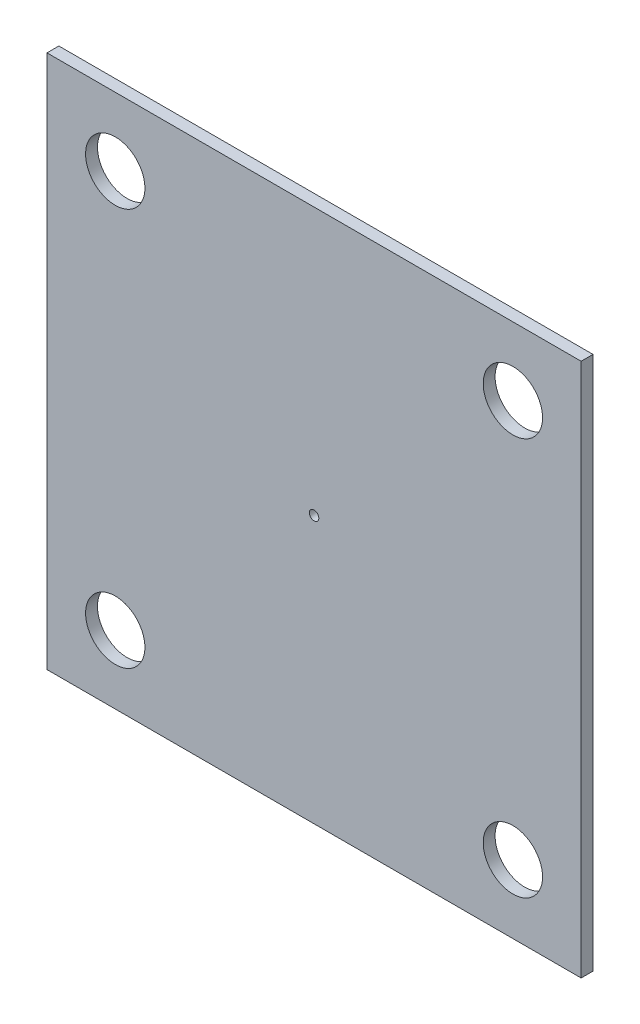
ISO-10303-21;
HEADER;
FILE_DESCRIPTION(('STEP AP214'),'2;1');
FILE_NAME('part.step','',(''),(''),'','','');
FILE_SCHEMA(('AUTOMOTIVE_DESIGN { 1 0 10303 214 1 1 1 1 }'));
ENDSEC;
DATA;
#1=APPLICATION_CONTEXT('core data for automotive mechanical design processes');
#2=APPLICATION_PROTOCOL_DEFINITION('international standard','automotive_design',2000,#1);
#3=PRODUCT_CONTEXT('',#1,'mechanical');
#4=PRODUCT('Part','Part','',(#3));
#5=PRODUCT_RELATED_PRODUCT_CATEGORY('part','',(#4));
#6=PRODUCT_DEFINITION_FORMATION('','',#4);
#7=PRODUCT_DEFINITION_CONTEXT('part definition',#1,'design');
#8=PRODUCT_DEFINITION('design','',#6,#7);
#9=PRODUCT_DEFINITION_SHAPE('','',#8);
#10=(LENGTH_UNIT() NAMED_UNIT(*) SI_UNIT(.MILLI.,.METRE.));
#11=(NAMED_UNIT(*) PLANE_ANGLE_UNIT() SI_UNIT($,.RADIAN.));
#12=(NAMED_UNIT(*) SI_UNIT($,.STERADIAN.) SOLID_ANGLE_UNIT());
#13=UNCERTAINTY_MEASURE_WITH_UNIT(LENGTH_MEASURE(1.E-05),#10,'distance_accuracy_value','');
#14=(GEOMETRIC_REPRESENTATION_CONTEXT(3) GLOBAL_UNCERTAINTY_ASSIGNED_CONTEXT((#13)) GLOBAL_UNIT_ASSIGNED_CONTEXT((#10,
#11,#12)) REPRESENTATION_CONTEXT('',''));
#15=CARTESIAN_POINT('',(0.,0.,0.));
#16=DIRECTION('',(0.,0.,1.));
#17=DIRECTION('',(1.,0.,0.));
#18=AXIS2_PLACEMENT_3D('',#15,#16,#17);
#19=CARTESIAN_POINT('',(0.,0.,5.));
#20=DIRECTION('',(0.,0.,1.));
#21=DIRECTION('',(1.,0.,0.));
#22=AXIS2_PLACEMENT_3D('',#19,#20,#21);
#23=PLANE('',#22);
#24=CARTESIAN_POINT('',(167.5,167.5,5.));
#25=DIRECTION('',(0.,0.,1.));
#26=DIRECTION('',(1.,0.,0.));
#27=AXIS2_PLACEMENT_3D('',#24,#25,#26);
#28=CIRCLE('',#27,25.);
#29=CARTESIAN_POINT('',(192.5,167.5,5.));
#30=VERTEX_POINT('',#29);
#31=EDGE_CURVE('E127',#30,#30,#28,.T.);
#32=ORIENTED_EDGE('',*,*,#31,.F.);
#33=EDGE_LOOP('',(#32));
#34=FACE_BOUND('',#33,.T.);
#35=CARTESIAN_POINT('',(-167.5,-167.5,5.));
#36=DIRECTION('',(0.,0.,1.));
#37=DIRECTION('',(1.,0.,0.));
#38=AXIS2_PLACEMENT_3D('',#35,#36,#37);
#39=CIRCLE('',#38,25.);
#40=CARTESIAN_POINT('',(-142.5,-167.5,5.));
#41=VERTEX_POINT('',#40);
#42=EDGE_CURVE('E115',#41,#41,#39,.T.);
#43=ORIENTED_EDGE('',*,*,#42,.F.);
#44=EDGE_LOOP('',(#43));
#45=FACE_BOUND('',#44,.T.);
#46=DIRECTION('',(0.,1.,0.));
#47=VECTOR('',#46,1.);
#48=CARTESIAN_POINT('',(225.,225.,5.));
#49=LINE('',#48,#47);
#50=CARTESIAN_POINT('',(225.,-225.,5.));
#51=VERTEX_POINT('',#50);
#52=CARTESIAN_POINT('',(225.,225.,5.));
#53=VERTEX_POINT('',#52);
#54=EDGE_CURVE('E85',#51,#53,#49,.T.);
#55=ORIENTED_EDGE('',*,*,#54,.T.);
#56=DIRECTION('',(-1.,0.,0.));
#57=VECTOR('',#56,1.);
#58=CARTESIAN_POINT('',(-225.,225.,5.));
#59=LINE('',#58,#57);
#60=CARTESIAN_POINT('',(-225.,225.,5.));
#61=VERTEX_POINT('',#60);
#62=EDGE_CURVE('E80',#53,#61,#59,.T.);
#63=ORIENTED_EDGE('',*,*,#62,.T.);
#64=DIRECTION('',(0.,-1.,0.));
#65=VECTOR('',#64,1.);
#66=CARTESIAN_POINT('',(-225.,225.,5.));
#67=LINE('',#66,#65);
#68=CARTESIAN_POINT('',(-225.,-225.,5.));
#69=VERTEX_POINT('',#68);
#70=EDGE_CURVE('E83',#61,#69,#67,.T.);
#71=ORIENTED_EDGE('',*,*,#70,.T.);
#72=DIRECTION('',(1.,0.,0.));
#73=VECTOR('',#72,1.);
#74=CARTESIAN_POINT('',(-225.,-225.,5.));
#75=LINE('',#74,#73);
#76=EDGE_CURVE('E50',#69,#51,#75,.T.);
#77=ORIENTED_EDGE('',*,*,#76,.T.);
#78=EDGE_LOOP('',(#55,#63,#71,#77));
#79=FACE_BOUND('',#78,.T.);
#80=CARTESIAN_POINT('',(0.,0.,5.));
#81=DIRECTION('',(0.,0.,1.));
#82=DIRECTION('',(1.,0.,0.));
#83=AXIS2_PLACEMENT_3D('',#80,#81,#82);
#84=CIRCLE('',#83,4.);
#85=CARTESIAN_POINT('',(4.,0.,5.));
#86=VERTEX_POINT('',#85);
#87=EDGE_CURVE('E100',#86,#86,#84,.T.);
#88=ORIENTED_EDGE('',*,*,#87,.F.);
#89=EDGE_LOOP('',(#88));
#90=FACE_BOUND('',#89,.T.);
#91=CARTESIAN_POINT('',(167.5,-167.5,5.));
#92=DIRECTION('',(0.,0.,1.));
#93=DIRECTION('',(1.,0.,0.));
#94=AXIS2_PLACEMENT_3D('',#91,#92,#93);
#95=CIRCLE('',#94,25.);
#96=CARTESIAN_POINT('',(192.5,-167.5,5.));
#97=VERTEX_POINT('',#96);
#98=EDGE_CURVE('E121',#97,#97,#95,.T.);
#99=ORIENTED_EDGE('',*,*,#98,.F.);
#100=EDGE_LOOP('',(#99));
#101=FACE_BOUND('',#100,.T.);
#102=CARTESIAN_POINT('',(-167.5,167.5,5.));
#103=DIRECTION('',(0.,0.,1.));
#104=DIRECTION('',(1.,0.,0.));
#105=AXIS2_PLACEMENT_3D('',#102,#103,#104);
#106=CIRCLE('',#105,25.);
#107=CARTESIAN_POINT('',(-142.5,167.5,5.));
#108=VERTEX_POINT('',#107);
#109=EDGE_CURVE('E133',#108,#108,#106,.T.);
#110=ORIENTED_EDGE('',*,*,#109,.F.);
#111=EDGE_LOOP('',(#110));
#112=FACE_BOUND('',#111,.T.);
#113=ADVANCED_FACE('F33',(#34,#45,#79,#90,#101,#112),#23,.T.);
#114=CARTESIAN_POINT('',(0.,0.,-5.));
#115=DIRECTION('',(0.,0.,1.));
#116=DIRECTION('',(1.,0.,0.));
#117=AXIS2_PLACEMENT_3D('',#114,#115,#116);
#118=PLANE('',#117);
#119=DIRECTION('',(0.,1.,0.));
#120=VECTOR('',#119,1.);
#121=CARTESIAN_POINT('',(225.,225.,-5.));
#122=LINE('',#121,#120);
#123=CARTESIAN_POINT('',(225.,-225.,-5.));
#124=VERTEX_POINT('',#123);
#125=CARTESIAN_POINT('',(225.,225.,-5.));
#126=VERTEX_POINT('',#125);
#127=EDGE_CURVE('E97',#124,#126,#122,.T.);
#128=ORIENTED_EDGE('',*,*,#127,.F.);
#129=DIRECTION('',(1.,0.,0.));
#130=VECTOR('',#129,1.);
#131=CARTESIAN_POINT('',(-225.,-225.,-5.));
#132=LINE('',#131,#130);
#133=CARTESIAN_POINT('',(-225.,-225.,-5.));
#134=VERTEX_POINT('',#133);
#135=EDGE_CURVE('E73',#134,#124,#132,.T.);
#136=ORIENTED_EDGE('',*,*,#135,.F.);
#137=DIRECTION('',(0.,-1.,0.));
#138=VECTOR('',#137,1.);
#139=CARTESIAN_POINT('',(-225.,225.,-5.));
#140=LINE('',#139,#138);
#141=CARTESIAN_POINT('',(-225.,225.,-5.));
#142=VERTEX_POINT('',#141);
#143=EDGE_CURVE('E67',#142,#134,#140,.T.);
#144=ORIENTED_EDGE('',*,*,#143,.F.);
#145=DIRECTION('',(-1.,0.,0.));
#146=VECTOR('',#145,1.);
#147=CARTESIAN_POINT('',(-225.,225.,-5.));
#148=LINE('',#147,#146);
#149=EDGE_CURVE('E89',#126,#142,#148,.T.);
#150=ORIENTED_EDGE('',*,*,#149,.F.);
#151=EDGE_LOOP('',(#128,#136,#144,#150));
#152=FACE_BOUND('',#151,.T.);
#153=CARTESIAN_POINT('',(0.,0.,-5.));
#154=DIRECTION('',(0.,0.,1.));
#155=DIRECTION('',(1.,0.,0.));
#156=AXIS2_PLACEMENT_3D('',#153,#154,#155);
#157=CIRCLE('',#156,4.);
#158=CARTESIAN_POINT('',(4.,0.,-5.));
#159=VERTEX_POINT('',#158);
#160=EDGE_CURVE('E112',#159,#159,#157,.T.);
#161=ORIENTED_EDGE('',*,*,#160,.T.);
#162=EDGE_LOOP('',(#161));
#163=FACE_BOUND('',#162,.T.);
#164=CARTESIAN_POINT('',(-167.5,-167.5,-5.));
#165=DIRECTION('',(0.,0.,1.));
#166=DIRECTION('',(1.,0.,0.));
#167=AXIS2_PLACEMENT_3D('',#164,#165,#166);
#168=CIRCLE('',#167,25.);
#169=CARTESIAN_POINT('',(-142.5,-167.5,-5.));
#170=VERTEX_POINT('',#169);
#171=EDGE_CURVE('E118',#170,#170,#168,.T.);
#172=ORIENTED_EDGE('',*,*,#171,.T.);
#173=EDGE_LOOP('',(#172));
#174=FACE_BOUND('',#173,.T.);
#175=CARTESIAN_POINT('',(167.5,-167.5,-5.));
#176=DIRECTION('',(0.,0.,1.));
#177=DIRECTION('',(1.,0.,0.));
#178=AXIS2_PLACEMENT_3D('',#175,#176,#177);
#179=CIRCLE('',#178,25.);
#180=CARTESIAN_POINT('',(192.5,-167.5,-5.));
#181=VERTEX_POINT('',#180);
#182=EDGE_CURVE('E124',#181,#181,#179,.T.);
#183=ORIENTED_EDGE('',*,*,#182,.T.);
#184=EDGE_LOOP('',(#183));
#185=FACE_BOUND('',#184,.T.);
#186=CARTESIAN_POINT('',(167.5,167.5,-5.));
#187=DIRECTION('',(0.,0.,1.));
#188=DIRECTION('',(1.,0.,0.));
#189=AXIS2_PLACEMENT_3D('',#186,#187,#188);
#190=CIRCLE('',#189,25.);
#191=CARTESIAN_POINT('',(192.5,167.5,-5.));
#192=VERTEX_POINT('',#191);
#193=EDGE_CURVE('E130',#192,#192,#190,.T.);
#194=ORIENTED_EDGE('',*,*,#193,.T.);
#195=EDGE_LOOP('',(#194));
#196=FACE_BOUND('',#195,.T.);
#197=CARTESIAN_POINT('',(-167.5,167.5,-5.));
#198=DIRECTION('',(0.,0.,1.));
#199=DIRECTION('',(1.,0.,0.));
#200=AXIS2_PLACEMENT_3D('',#197,#198,#199);
#201=CIRCLE('',#200,25.);
#202=CARTESIAN_POINT('',(-142.5,167.5,-5.));
#203=VERTEX_POINT('',#202);
#204=EDGE_CURVE('E136',#203,#203,#201,.T.);
#205=ORIENTED_EDGE('',*,*,#204,.T.);
#206=EDGE_LOOP('',(#205));
#207=FACE_BOUND('',#206,.T.);
#208=ADVANCED_FACE('F108',(#152,#163,#174,#185,#196,#207),#118,.F.);
#209=CARTESIAN_POINT('',(225.,225.,5.));
#210=DIRECTION('',(-1.,0.,0.));
#211=DIRECTION('',(0.,-1.,0.));
#212=AXIS2_PLACEMENT_3D('',#209,#210,#211);
#213=PLANE('',#212);
#214=ORIENTED_EDGE('',*,*,#127,.T.);
#215=DIRECTION('',(0.,0.,-1.));
#216=VECTOR('',#215,1.);
#217=CARTESIAN_POINT('',(225.,225.,5.));
#218=LINE('',#217,#216);
#219=EDGE_CURVE('E11',#53,#126,#218,.T.);
#220=ORIENTED_EDGE('',*,*,#219,.F.);
#221=ORIENTED_EDGE('',*,*,#54,.F.);
#222=DIRECTION('',(0.,0.,-1.));
#223=VECTOR('',#222,1.);
#224=CARTESIAN_POINT('',(225.,-225.,5.));
#225=LINE('',#224,#223);
#226=EDGE_CURVE('E93',#51,#124,#225,.T.);
#227=ORIENTED_EDGE('',*,*,#226,.T.);
#228=EDGE_LOOP('',(#214,#220,#221,#227));
#229=FACE_BOUND('',#228,.T.);
#230=ADVANCED_FACE('F35',(#229),#213,.F.);
#231=CARTESIAN_POINT('',(-225.,225.,5.));
#232=DIRECTION('',(0.,-1.,0.));
#233=DIRECTION('',(0.,0.,-1.));
#234=AXIS2_PLACEMENT_3D('',#231,#232,#233);
#235=PLANE('',#234);
#236=ORIENTED_EDGE('',*,*,#149,.T.);
#237=DIRECTION('',(0.,0.,-1.));
#238=VECTOR('',#237,1.);
#239=CARTESIAN_POINT('',(-225.,225.,5.));
#240=LINE('',#239,#238);
#241=EDGE_CURVE('E42',#61,#142,#240,.T.);
#242=ORIENTED_EDGE('',*,*,#241,.F.);
#243=ORIENTED_EDGE('',*,*,#62,.F.);
#244=ORIENTED_EDGE('',*,*,#219,.T.);
#245=EDGE_LOOP('',(#236,#242,#243,#244));
#246=FACE_BOUND('',#245,.T.);
#247=ADVANCED_FACE('F88',(#246),#235,.F.);
#248=CARTESIAN_POINT('',(-225.,225.,5.));
#249=DIRECTION('',(1.,0.,0.));
#250=DIRECTION('',(0.,1.,0.));
#251=AXIS2_PLACEMENT_3D('',#248,#249,#250);
#252=PLANE('',#251);
#253=ORIENTED_EDGE('',*,*,#143,.T.);
#254=DIRECTION('',(0.,0.,-1.));
#255=VECTOR('',#254,1.);
#256=CARTESIAN_POINT('',(-225.,-225.,5.));
#257=LINE('',#256,#255);
#258=EDGE_CURVE('E90',#69,#134,#257,.T.);
#259=ORIENTED_EDGE('',*,*,#258,.F.);
#260=ORIENTED_EDGE('',*,*,#70,.F.);
#261=ORIENTED_EDGE('',*,*,#241,.T.);
#262=EDGE_LOOP('',(#253,#259,#260,#261));
#263=FACE_BOUND('',#262,.T.);
#264=ADVANCED_FACE('F91',(#263),#252,.F.);
#265=CARTESIAN_POINT('',(-225.,-225.,5.));
#266=DIRECTION('',(0.,1.,0.));
#267=DIRECTION('',(0.,0.,1.));
#268=AXIS2_PLACEMENT_3D('',#265,#266,#267);
#269=PLANE('',#268);
#270=ORIENTED_EDGE('',*,*,#135,.T.);
#271=ORIENTED_EDGE('',*,*,#226,.F.);
#272=ORIENTED_EDGE('',*,*,#76,.F.);
#273=ORIENTED_EDGE('',*,*,#258,.T.);
#274=EDGE_LOOP('',(#270,#271,#272,#273));
#275=FACE_BOUND('',#274,.T.);
#276=ADVANCED_FACE('F105',(#275),#269,.F.);
#277=CARTESIAN_POINT('',(0.,0.,5.));
#278=DIRECTION('',(0.,0.,-1.));
#279=DIRECTION('',(-1.,0.,0.));
#280=AXIS2_PLACEMENT_3D('',#277,#278,#279);
#281=CYLINDRICAL_SURFACE('',#280,4.);
#282=ORIENTED_EDGE('',*,*,#87,.T.);
#283=EDGE_LOOP('',(#282));
#284=FACE_BOUND('',#283,.T.);
#285=ORIENTED_EDGE('',*,*,#160,.F.);
#286=EDGE_LOOP('',(#285));
#287=FACE_BOUND('',#286,.T.);
#288=ADVANCED_FACE('F155',(#284,#287),#281,.F.);
#289=CARTESIAN_POINT('',(-167.5,-167.5,5.));
#290=DIRECTION('',(0.,0.,-1.));
#291=DIRECTION('',(-1.,0.,0.));
#292=AXIS2_PLACEMENT_3D('',#289,#290,#291);
#293=CYLINDRICAL_SURFACE('',#292,25.);
#294=ORIENTED_EDGE('',*,*,#42,.T.);
#295=EDGE_LOOP('',(#294));
#296=FACE_BOUND('',#295,.T.);
#297=ORIENTED_EDGE('',*,*,#171,.F.);
#298=EDGE_LOOP('',(#297));
#299=FACE_BOUND('',#298,.T.);
#300=ADVANCED_FACE('F201',(#296,#299),#293,.F.);
#301=CARTESIAN_POINT('',(167.5,-167.5,5.));
#302=DIRECTION('',(0.,0.,-1.));
#303=DIRECTION('',(-1.,0.,0.));
#304=AXIS2_PLACEMENT_3D('',#301,#302,#303);
#305=CYLINDRICAL_SURFACE('',#304,25.);
#306=ORIENTED_EDGE('',*,*,#98,.T.);
#307=EDGE_LOOP('',(#306));
#308=FACE_BOUND('',#307,.T.);
#309=ORIENTED_EDGE('',*,*,#182,.F.);
#310=EDGE_LOOP('',(#309));
#311=FACE_BOUND('',#310,.T.);
#312=ADVANCED_FACE('F209',(#308,#311),#305,.F.);
#313=CARTESIAN_POINT('',(167.5,167.5,5.));
#314=DIRECTION('',(0.,0.,-1.));
#315=DIRECTION('',(-1.,0.,0.));
#316=AXIS2_PLACEMENT_3D('',#313,#314,#315);
#317=CYLINDRICAL_SURFACE('',#316,25.);
#318=ORIENTED_EDGE('',*,*,#31,.T.);
#319=EDGE_LOOP('',(#318));
#320=FACE_BOUND('',#319,.T.);
#321=ORIENTED_EDGE('',*,*,#193,.F.);
#322=EDGE_LOOP('',(#321));
#323=FACE_BOUND('',#322,.T.);
#324=ADVANCED_FACE('F217',(#320,#323),#317,.F.);
#325=CARTESIAN_POINT('',(-167.5,167.5,5.));
#326=DIRECTION('',(0.,0.,-1.));
#327=DIRECTION('',(-1.,0.,0.));
#328=AXIS2_PLACEMENT_3D('',#325,#326,#327);
#329=CYLINDRICAL_SURFACE('',#328,25.);
#330=ORIENTED_EDGE('',*,*,#109,.T.);
#331=EDGE_LOOP('',(#330));
#332=FACE_BOUND('',#331,.T.);
#333=ORIENTED_EDGE('',*,*,#204,.F.);
#334=EDGE_LOOP('',(#333));
#335=FACE_BOUND('',#334,.T.);
#336=ADVANCED_FACE('F142',(#332,#335),#329,.F.);
#337=CLOSED_SHELL('',(#113,#208,#230,#247,#264,#276,#288,#300,#312,#324,#336));
#338=MANIFOLD_SOLID_BREP('B2',#337);
#339=ADVANCED_BREP_SHAPE_REPRESENTATION('',(#18,#338),#14);
#340=SHAPE_DEFINITION_REPRESENTATION(#9,#339);
ENDSEC;
END-ISO-10303-21;
